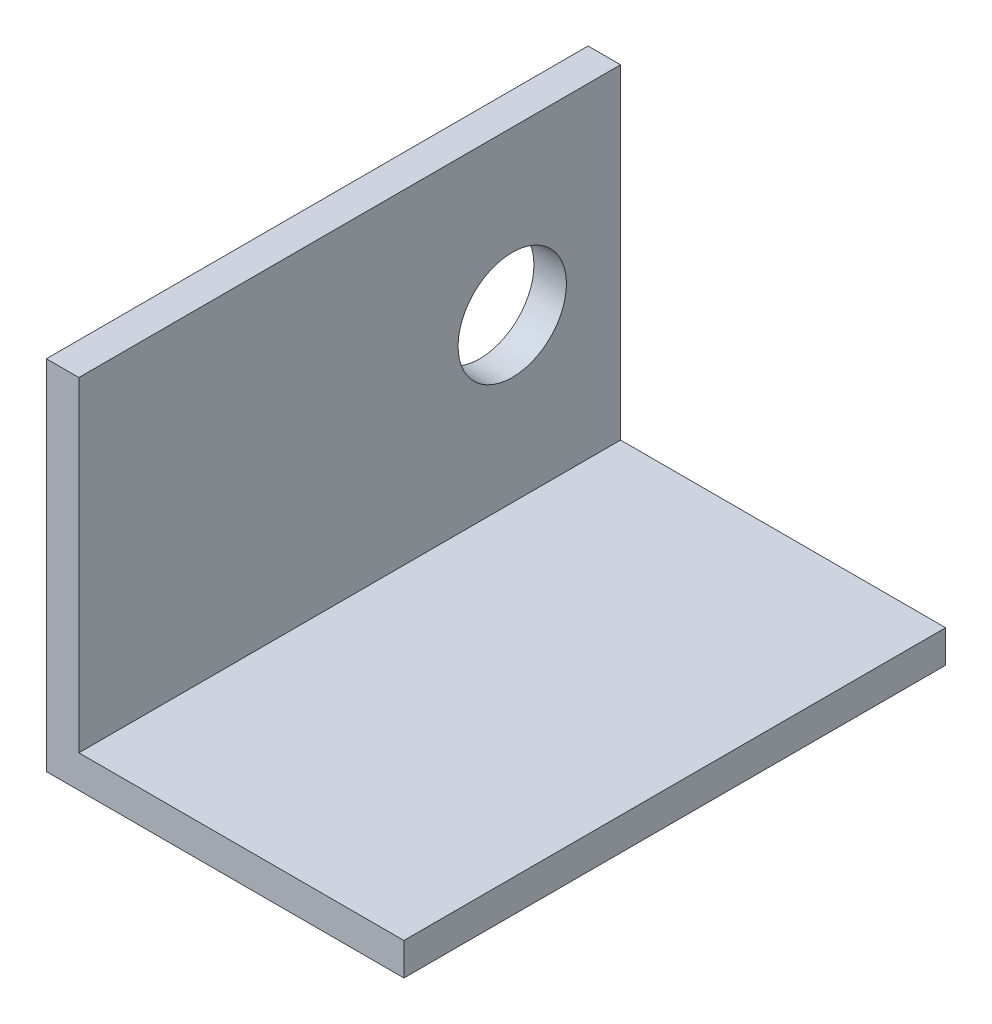
ISO-10303-21;
HEADER;
FILE_DESCRIPTION(('STEP AP214'),'2;1');
FILE_NAME('part.step','',(''),(''),'','','');
FILE_SCHEMA(('AUTOMOTIVE_DESIGN { 1 0 10303 214 1 1 1 1 }'));
ENDSEC;
DATA;
#1=APPLICATION_CONTEXT('core data for automotive mechanical design processes');
#2=APPLICATION_PROTOCOL_DEFINITION('international standard','automotive_design',2000,#1);
#3=PRODUCT_CONTEXT('',#1,'mechanical');
#4=PRODUCT('Part','Part','',(#3));
#5=PRODUCT_RELATED_PRODUCT_CATEGORY('part','',(#4));
#6=PRODUCT_DEFINITION_FORMATION('','',#4);
#7=PRODUCT_DEFINITION_CONTEXT('part definition',#1,'design');
#8=PRODUCT_DEFINITION('design','',#6,#7);
#9=PRODUCT_DEFINITION_SHAPE('','',#8);
#10=(LENGTH_UNIT() NAMED_UNIT(*) SI_UNIT(.MILLI.,.METRE.));
#11=(NAMED_UNIT(*) PLANE_ANGLE_UNIT() SI_UNIT($,.RADIAN.));
#12=(NAMED_UNIT(*) SI_UNIT($,.STERADIAN.) SOLID_ANGLE_UNIT());
#13=UNCERTAINTY_MEASURE_WITH_UNIT(LENGTH_MEASURE(1.E-05),#10,'distance_accuracy_value','');
#14=(GEOMETRIC_REPRESENTATION_CONTEXT(3) GLOBAL_UNCERTAINTY_ASSIGNED_CONTEXT((#13)) GLOBAL_UNIT_ASSIGNED_CONTEXT((#10,
#11,#12)) REPRESENTATION_CONTEXT('',''));
#15=CARTESIAN_POINT('',(0.,0.,0.));
#16=DIRECTION('',(0.,0.,1.));
#17=DIRECTION('',(1.,0.,0.));
#18=AXIS2_PLACEMENT_3D('',#15,#16,#17);
#19=CARTESIAN_POINT('',(0.,-3.,-50.));
#20=DIRECTION('',(0.,-1.,0.));
#21=DIRECTION('',(0.,0.,-1.));
#22=AXIS2_PLACEMENT_3D('',#19,#20,#21);
#23=PLANE('',#22);
#24=DIRECTION('',(1.,0.,0.));
#25=VECTOR('',#24,1.);
#26=CARTESIAN_POINT('',(0.,-3.,0.));
#27=LINE('',#26,#25);
#28=CARTESIAN_POINT('',(-3.,-3.,0.));
#29=VERTEX_POINT('',#28);
#30=CARTESIAN_POINT('',(30.,-3.,0.));
#31=VERTEX_POINT('',#30);
#32=EDGE_CURVE('E116',#29,#31,#27,.T.);
#33=ORIENTED_EDGE('',*,*,#32,.F.);
#34=DIRECTION('',(0.,0.,1.));
#35=VECTOR('',#34,1.);
#36=CARTESIAN_POINT('',(-3.,-3.,-50.));
#37=LINE('',#36,#35);
#38=CARTESIAN_POINT('',(-3.,-3.,-50.));
#39=VERTEX_POINT('',#38);
#40=EDGE_CURVE('E11',#39,#29,#37,.T.);
#41=ORIENTED_EDGE('',*,*,#40,.F.);
#42=DIRECTION('',(1.,0.,0.));
#43=VECTOR('',#42,1.);
#44=CARTESIAN_POINT('',(0.,-3.,-50.));
#45=LINE('',#44,#43);
#46=CARTESIAN_POINT('',(30.,-3.,-50.));
#47=VERTEX_POINT('',#46);
#48=EDGE_CURVE('E129',#39,#47,#45,.T.);
#49=ORIENTED_EDGE('',*,*,#48,.T.);
#50=DIRECTION('',(0.,0.,1.));
#51=VECTOR('',#50,1.);
#52=CARTESIAN_POINT('',(30.,-3.,-50.));
#53=LINE('',#52,#51);
#54=EDGE_CURVE('E115',#47,#31,#53,.T.);
#55=ORIENTED_EDGE('',*,*,#54,.T.);
#56=EDGE_LOOP('',(#33,#41,#49,#55));
#57=FACE_BOUND('',#56,.T.);
#58=ADVANCED_FACE('F33',(#57),#23,.T.);
#59=CARTESIAN_POINT('',(-3.,30.,-50.));
#60=DIRECTION('',(-1.,0.,0.));
#61=DIRECTION('',(0.,-1.,0.));
#62=AXIS2_PLACEMENT_3D('',#59,#60,#61);
#63=PLANE('',#62);
#64=CARTESIAN_POINT('',(-3.,15.,-40.));
#65=DIRECTION('',(-1.,0.,0.));
#66=DIRECTION('',(0.,-1.,0.));
#67=AXIS2_PLACEMENT_3D('',#64,#65,#66);
#68=CIRCLE('',#67,5.);
#69=CARTESIAN_POINT('',(-3.,10.,-40.));
#70=VERTEX_POINT('',#69);
#71=EDGE_CURVE('E176',#70,#70,#68,.T.);
#72=ORIENTED_EDGE('',*,*,#71,.F.);
#73=EDGE_LOOP('',(#72));
#74=FACE_BOUND('',#73,.T.);
#75=DIRECTION('',(0.,-1.,0.));
#76=VECTOR('',#75,1.);
#77=CARTESIAN_POINT('',(-3.,30.,0.));
#78=LINE('',#77,#76);
#79=CARTESIAN_POINT('',(-3.,30.,0.));
#80=VERTEX_POINT('',#79);
#81=EDGE_CURVE('E127',#80,#29,#78,.T.);
#82=ORIENTED_EDGE('',*,*,#81,.F.);
#83=DIRECTION('',(0.,0.,1.));
#84=VECTOR('',#83,1.);
#85=CARTESIAN_POINT('',(-3.,30.,-50.));
#86=LINE('',#85,#84);
#87=CARTESIAN_POINT('',(-3.,30.,-50.));
#88=VERTEX_POINT('',#87);
#89=EDGE_CURVE('E42',#88,#80,#86,.T.);
#90=ORIENTED_EDGE('',*,*,#89,.F.);
#91=DIRECTION('',(0.,-1.,0.));
#92=VECTOR('',#91,1.);
#93=CARTESIAN_POINT('',(-3.,30.,-50.));
#94=LINE('',#93,#92);
#95=EDGE_CURVE('E96',#88,#39,#94,.T.);
#96=ORIENTED_EDGE('',*,*,#95,.T.);
#97=ORIENTED_EDGE('',*,*,#40,.T.);
#98=EDGE_LOOP('',(#82,#90,#96,#97));
#99=FACE_BOUND('',#98,.T.);
#100=ADVANCED_FACE('F142',(#74,#99),#63,.T.);
#101=CARTESIAN_POINT('',(-3.,30.,-50.));
#102=DIRECTION('',(0.,-1.,0.));
#103=DIRECTION('',(0.,0.,-1.));
#104=AXIS2_PLACEMENT_3D('',#101,#102,#103);
#105=PLANE('',#104);
#106=DIRECTION('',(1.,0.,0.));
#107=VECTOR('',#106,1.);
#108=CARTESIAN_POINT('',(-3.,30.,0.));
#109=LINE('',#108,#107);
#110=CARTESIAN_POINT('',(0.,30.,0.));
#111=VERTEX_POINT('',#110);
#112=EDGE_CURVE('E101',#80,#111,#109,.T.);
#113=ORIENTED_EDGE('',*,*,#112,.T.);
#114=DIRECTION('',(0.,0.,1.));
#115=VECTOR('',#114,1.);
#116=CARTESIAN_POINT('',(0.,30.,-50.));
#117=LINE('',#116,#115);
#118=CARTESIAN_POINT('',(0.,30.,-50.));
#119=VERTEX_POINT('',#118);
#120=EDGE_CURVE('E99',#119,#111,#117,.T.);
#121=ORIENTED_EDGE('',*,*,#120,.F.);
#122=DIRECTION('',(1.,0.,0.));
#123=VECTOR('',#122,1.);
#124=CARTESIAN_POINT('',(-3.,30.,-50.));
#125=LINE('',#124,#123);
#126=EDGE_CURVE('E90',#88,#119,#125,.T.);
#127=ORIENTED_EDGE('',*,*,#126,.F.);
#128=ORIENTED_EDGE('',*,*,#89,.T.);
#129=EDGE_LOOP('',(#113,#121,#127,#128));
#130=FACE_BOUND('',#129,.T.);
#131=ADVANCED_FACE('F100',(#130),#105,.F.);
#132=CARTESIAN_POINT('',(0.,30.,-50.));
#133=DIRECTION('',(-1.,0.,0.));
#134=DIRECTION('',(0.,-1.,0.));
#135=AXIS2_PLACEMENT_3D('',#132,#133,#134);
#136=PLANE('',#135);
#137=CARTESIAN_POINT('',(0.,15.,-40.));
#138=DIRECTION('',(-1.,0.,0.));
#139=DIRECTION('',(0.,-1.,0.));
#140=AXIS2_PLACEMENT_3D('',#137,#138,#139);
#141=CIRCLE('',#140,5.);
#142=CARTESIAN_POINT('',(0.,10.,-40.));
#143=VERTEX_POINT('',#142);
#144=EDGE_CURVE('E36',#143,#143,#141,.T.);
#145=ORIENTED_EDGE('',*,*,#144,.T.);
#146=EDGE_LOOP('',(#145));
#147=FACE_BOUND('',#146,.T.);
#148=DIRECTION('',(0.,-1.,0.));
#149=VECTOR('',#148,1.);
#150=CARTESIAN_POINT('',(0.,30.,0.));
#151=LINE('',#150,#149);
#152=CARTESIAN_POINT('',(0.,0.,0.));
#153=VERTEX_POINT('',#152);
#154=EDGE_CURVE('E124',#111,#153,#151,.T.);
#155=ORIENTED_EDGE('',*,*,#154,.T.);
#156=DIRECTION('',(0.,0.,1.));
#157=VECTOR('',#156,1.);
#158=CARTESIAN_POINT('',(0.,0.,-50.));
#159=LINE('',#158,#157);
#160=CARTESIAN_POINT('',(0.,0.,-50.));
#161=VERTEX_POINT('',#160);
#162=EDGE_CURVE('E104',#161,#153,#159,.T.);
#163=ORIENTED_EDGE('',*,*,#162,.F.);
#164=DIRECTION('',(0.,-1.,0.));
#165=VECTOR('',#164,1.);
#166=CARTESIAN_POINT('',(0.,30.,-50.));
#167=LINE('',#166,#165);
#168=EDGE_CURVE('E94',#119,#161,#167,.T.);
#169=ORIENTED_EDGE('',*,*,#168,.F.);
#170=ORIENTED_EDGE('',*,*,#120,.T.);
#171=EDGE_LOOP('',(#155,#163,#169,#170));
#172=FACE_BOUND('',#171,.T.);
#173=ADVANCED_FACE('F106',(#147,#172),#136,.F.);
#174=CARTESIAN_POINT('',(0.,0.,-50.));
#175=DIRECTION('',(0.,-1.,0.));
#176=DIRECTION('',(0.,0.,-1.));
#177=AXIS2_PLACEMENT_3D('',#174,#175,#176);
#178=PLANE('',#177);
#179=DIRECTION('',(1.,0.,0.));
#180=VECTOR('',#179,1.);
#181=CARTESIAN_POINT('',(0.,0.,0.));
#182=LINE('',#181,#180);
#183=CARTESIAN_POINT('',(30.,0.,0.));
#184=VERTEX_POINT('',#183);
#185=EDGE_CURVE('E122',#153,#184,#182,.T.);
#186=ORIENTED_EDGE('',*,*,#185,.T.);
#187=DIRECTION('',(0.,0.,1.));
#188=VECTOR('',#187,1.);
#189=CARTESIAN_POINT('',(30.,0.,-50.));
#190=LINE('',#189,#188);
#191=CARTESIAN_POINT('',(30.,0.,-50.));
#192=VERTEX_POINT('',#191);
#193=EDGE_CURVE('E133',#192,#184,#190,.T.);
#194=ORIENTED_EDGE('',*,*,#193,.F.);
#195=DIRECTION('',(1.,0.,0.));
#196=VECTOR('',#195,1.);
#197=CARTESIAN_POINT('',(0.,0.,-50.));
#198=LINE('',#197,#196);
#199=EDGE_CURVE('E109',#161,#192,#198,.T.);
#200=ORIENTED_EDGE('',*,*,#199,.F.);
#201=ORIENTED_EDGE('',*,*,#162,.T.);
#202=EDGE_LOOP('',(#186,#194,#200,#201));
#203=FACE_BOUND('',#202,.T.);
#204=ADVANCED_FACE('F157',(#203),#178,.F.);
#205=CARTESIAN_POINT('',(30.,0.,-50.));
#206=DIRECTION('',(-1.,0.,0.));
#207=DIRECTION('',(0.,0.,1.));
#208=AXIS2_PLACEMENT_3D('',#205,#206,#207);
#209=PLANE('',#208);
#210=DIRECTION('',(0.,-1.,0.));
#211=VECTOR('',#210,1.);
#212=CARTESIAN_POINT('',(30.,0.,0.));
#213=LINE('',#212,#211);
#214=EDGE_CURVE('E119',#184,#31,#213,.T.);
#215=ORIENTED_EDGE('',*,*,#214,.T.);
#216=ORIENTED_EDGE('',*,*,#54,.F.);
#217=DIRECTION('',(0.,-1.,0.));
#218=VECTOR('',#217,1.);
#219=CARTESIAN_POINT('',(30.,0.,-50.));
#220=LINE('',#219,#218);
#221=EDGE_CURVE('E82',#192,#47,#220,.T.);
#222=ORIENTED_EDGE('',*,*,#221,.F.);
#223=ORIENTED_EDGE('',*,*,#193,.T.);
#224=EDGE_LOOP('',(#215,#216,#222,#223));
#225=FACE_BOUND('',#224,.T.);
#226=ADVANCED_FACE('F137',(#225),#209,.F.);
#227=CARTESIAN_POINT('',(0.,0.,-50.));
#228=DIRECTION('',(0.,0.,-1.));
#229=DIRECTION('',(-1.,0.,0.));
#230=AXIS2_PLACEMENT_3D('',#227,#228,#229);
#231=PLANE('',#230);
#232=ORIENTED_EDGE('',*,*,#48,.F.);
#233=ORIENTED_EDGE('',*,*,#95,.F.);
#234=ORIENTED_EDGE('',*,*,#126,.T.);
#235=ORIENTED_EDGE('',*,*,#168,.T.);
#236=ORIENTED_EDGE('',*,*,#199,.T.);
#237=ORIENTED_EDGE('',*,*,#221,.T.);
#238=EDGE_LOOP('',(#232,#233,#234,#235,#236,#237));
#239=FACE_BOUND('',#238,.T.);
#240=ADVANCED_FACE('F92',(#239),#231,.T.);
#241=CARTESIAN_POINT('',(0.,0.,0.));
#242=DIRECTION('',(0.,0.,-1.));
#243=DIRECTION('',(-1.,0.,0.));
#244=AXIS2_PLACEMENT_3D('',#241,#242,#243);
#245=PLANE('',#244);
#246=ORIENTED_EDGE('',*,*,#32,.T.);
#247=ORIENTED_EDGE('',*,*,#214,.F.);
#248=ORIENTED_EDGE('',*,*,#185,.F.);
#249=ORIENTED_EDGE('',*,*,#154,.F.);
#250=ORIENTED_EDGE('',*,*,#112,.F.);
#251=ORIENTED_EDGE('',*,*,#81,.T.);
#252=EDGE_LOOP('',(#246,#247,#248,#249,#250,#251));
#253=FACE_BOUND('',#252,.T.);
#254=ADVANCED_FACE('F141',(#253),#245,.F.);
#255=CARTESIAN_POINT('',(7.,15.,-40.));
#256=DIRECTION('',(-1.,0.,0.));
#257=DIRECTION('',(0.,-1.,0.));
#258=AXIS2_PLACEMENT_3D('',#255,#256,#257);
#259=CYLINDRICAL_SURFACE('',#258,5.);
#260=ORIENTED_EDGE('',*,*,#71,.T.);
#261=EDGE_LOOP('',(#260));
#262=FACE_BOUND('',#261,.T.);
#263=ORIENTED_EDGE('',*,*,#144,.F.);
#264=EDGE_LOOP('',(#263));
#265=FACE_BOUND('',#264,.T.);
#266=ADVANCED_FACE('F168',(#262,#265),#259,.F.);
#267=CLOSED_SHELL('',(#58,#100,#131,#173,#204,#226,#240,#254,#266));
#268=MANIFOLD_SOLID_BREP('B2',#267);
#269=ADVANCED_BREP_SHAPE_REPRESENTATION('',(#18,#268),#14);
#270=SHAPE_DEFINITION_REPRESENTATION(#9,#269);
ENDSEC;
END-ISO-10303-21;
